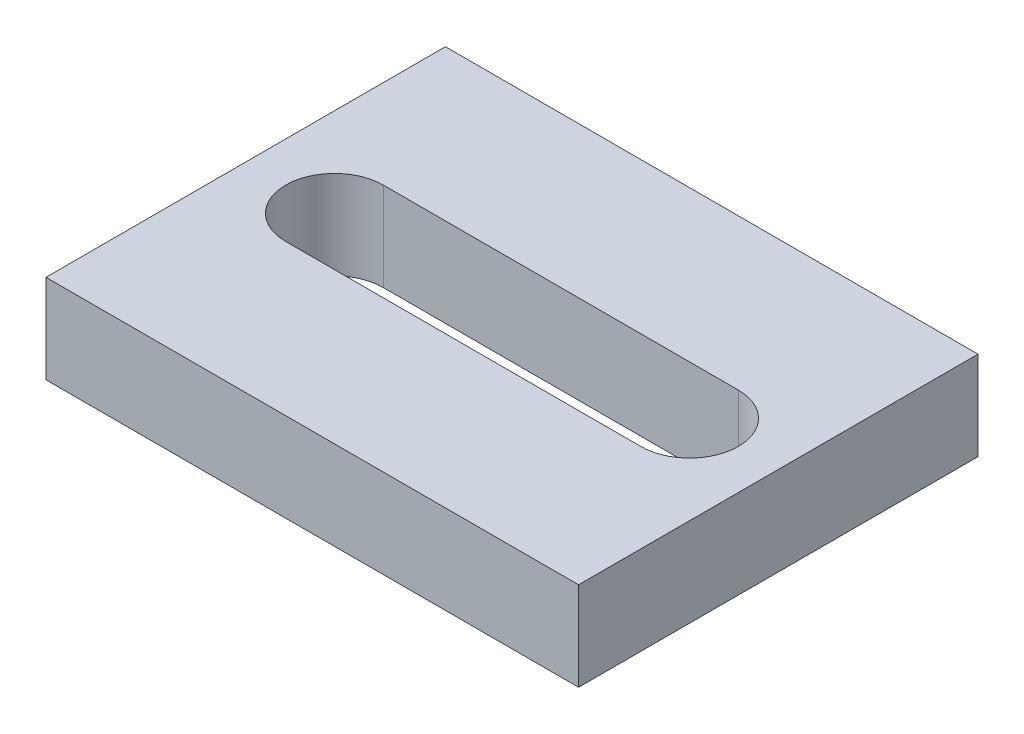
ISO-10303-21;
HEADER;
FILE_DESCRIPTION(('STEP AP214'),'2;1');
FILE_NAME('part.step','',(''),(''),'','','');
FILE_SCHEMA(('AUTOMOTIVE_DESIGN { 1 0 10303 214 1 1 1 1 }'));
ENDSEC;
DATA;
#1=APPLICATION_CONTEXT('core data for automotive mechanical design processes');
#2=APPLICATION_PROTOCOL_DEFINITION('international standard','automotive_design',2000,#1);
#3=PRODUCT_CONTEXT('',#1,'mechanical');
#4=PRODUCT('Part','Part','',(#3));
#5=PRODUCT_RELATED_PRODUCT_CATEGORY('part','',(#4));
#6=PRODUCT_DEFINITION_FORMATION('','',#4);
#7=PRODUCT_DEFINITION_CONTEXT('part definition',#1,'design');
#8=PRODUCT_DEFINITION('design','',#6,#7);
#9=PRODUCT_DEFINITION_SHAPE('','',#8);
#10=(LENGTH_UNIT() NAMED_UNIT(*) SI_UNIT(.MILLI.,.METRE.));
#11=(NAMED_UNIT(*) PLANE_ANGLE_UNIT() SI_UNIT($,.RADIAN.));
#12=(NAMED_UNIT(*) SI_UNIT($,.STERADIAN.) SOLID_ANGLE_UNIT());
#13=UNCERTAINTY_MEASURE_WITH_UNIT(LENGTH_MEASURE(1.E-05),#10,'distance_accuracy_value','');
#14=(GEOMETRIC_REPRESENTATION_CONTEXT(3) GLOBAL_UNCERTAINTY_ASSIGNED_CONTEXT((#13)) GLOBAL_UNIT_ASSIGNED_CONTEXT((#10,
#11,#12)) REPRESENTATION_CONTEXT('',''));
#15=CARTESIAN_POINT('',(0.,0.,0.));
#16=DIRECTION('',(0.,0.,1.));
#17=DIRECTION('',(1.,0.,0.));
#18=AXIS2_PLACEMENT_3D('',#15,#16,#17);
#19=CARTESIAN_POINT('',(0.,6.35,0.));
#20=DIRECTION('',(0.,-1.,0.));
#21=DIRECTION('',(0.,0.,-1.));
#22=AXIS2_PLACEMENT_3D('',#19,#20,#21);
#23=PLANE('',#22);
#24=DIRECTION('',(0.,0.,1.));
#25=VECTOR('',#24,1.);
#26=CARTESIAN_POINT('',(-38.1,6.35,-28.575));
#27=LINE('',#26,#25);
#28=CARTESIAN_POINT('',(-38.1,6.35,-28.575));
#29=VERTEX_POINT('',#28);
#30=CARTESIAN_POINT('',(-38.1,6.35,28.575));
#31=VERTEX_POINT('',#30);
#32=EDGE_CURVE('E134',#29,#31,#27,.T.);
#33=ORIENTED_EDGE('',*,*,#32,.T.);
#34=DIRECTION('',(1.,0.,0.));
#35=VECTOR('',#34,1.);
#36=CARTESIAN_POINT('',(38.1,6.35,28.575));
#37=LINE('',#36,#35);
#38=CARTESIAN_POINT('',(38.1,6.35,28.575));
#39=VERTEX_POINT('',#38);
#40=EDGE_CURVE('E137',#31,#39,#37,.T.);
#41=ORIENTED_EDGE('',*,*,#40,.T.);
#42=DIRECTION('',(0.,0.,-1.));
#43=VECTOR('',#42,1.);
#44=CARTESIAN_POINT('',(38.1,6.35,-28.575));
#45=LINE('',#44,#43);
#46=CARTESIAN_POINT('',(38.1,6.35,-28.575));
#47=VERTEX_POINT('',#46);
#48=EDGE_CURVE('E140',#39,#47,#45,.T.);
#49=ORIENTED_EDGE('',*,*,#48,.T.);
#50=DIRECTION('',(-1.,0.,0.));
#51=VECTOR('',#50,1.);
#52=CARTESIAN_POINT('',(38.1,6.35,-28.575));
#53=LINE('',#52,#51);
#54=EDGE_CURVE('E142',#47,#29,#53,.T.);
#55=ORIENTED_EDGE('',*,*,#54,.T.);
#56=EDGE_LOOP('',(#33,#41,#49,#55));
#57=FACE_BOUND('',#56,.T.);
#58=CARTESIAN_POINT('',(-25.4,6.35,0.));
#59=DIRECTION('',(0.,1.,0.));
#60=DIRECTION('',(0.,0.,1.));
#61=AXIS2_PLACEMENT_3D('',#58,#59,#60);
#62=CIRCLE('',#61,6.985);
#63=CARTESIAN_POINT('',(-25.4,6.35,-6.985));
#64=VERTEX_POINT('',#63);
#65=CARTESIAN_POINT('',(-25.4,6.35,6.985));
#66=VERTEX_POINT('',#65);
#67=EDGE_CURVE('E98',#64,#66,#62,.T.);
#68=ORIENTED_EDGE('',*,*,#67,.F.);
#69=DIRECTION('',(-1.,0.,0.));
#70=VECTOR('',#69,1.);
#71=CARTESIAN_POINT('',(-25.4,6.35,-6.985));
#72=LINE('',#71,#70);
#73=CARTESIAN_POINT('',(25.4,6.35,-6.985));
#74=VERTEX_POINT('',#73);
#75=EDGE_CURVE('E120',#74,#64,#72,.T.);
#76=ORIENTED_EDGE('',*,*,#75,.F.);
#77=CARTESIAN_POINT('',(25.4,6.35,0.));
#78=DIRECTION('',(0.,1.,0.));
#79=DIRECTION('',(0.,0.,1.));
#80=AXIS2_PLACEMENT_3D('',#77,#78,#79);
#81=CIRCLE('',#80,6.985);
#82=CARTESIAN_POINT('',(25.4,6.35,6.985));
#83=VERTEX_POINT('',#82);
#84=EDGE_CURVE('E118',#83,#74,#81,.T.);
#85=ORIENTED_EDGE('',*,*,#84,.F.);
#86=DIRECTION('',(1.,0.,0.));
#87=VECTOR('',#86,1.);
#88=CARTESIAN_POINT('',(-25.4,6.35,6.985));
#89=LINE('',#88,#87);
#90=EDGE_CURVE('E106',#66,#83,#89,.T.);
#91=ORIENTED_EDGE('',*,*,#90,.F.);
#92=EDGE_LOOP('',(#68,#76,#85,#91));
#93=FACE_BOUND('',#92,.T.);
#94=ADVANCED_FACE('F33',(#57,#93),#23,.F.);
#95=CARTESIAN_POINT('',(0.,-6.35,0.));
#96=DIRECTION('',(0.,-1.,0.));
#97=DIRECTION('',(0.,0.,-1.));
#98=AXIS2_PLACEMENT_3D('',#95,#96,#97);
#99=PLANE('',#98);
#100=DIRECTION('',(0.,0.,1.));
#101=VECTOR('',#100,1.);
#102=CARTESIAN_POINT('',(-38.1,-6.35,-28.575));
#103=LINE('',#102,#101);
#104=CARTESIAN_POINT('',(-38.1,-6.35,-28.575));
#105=VERTEX_POINT('',#104);
#106=CARTESIAN_POINT('',(-38.1,-6.35,28.575));
#107=VERTEX_POINT('',#106);
#108=EDGE_CURVE('E114',#105,#107,#103,.T.);
#109=ORIENTED_EDGE('',*,*,#108,.F.);
#110=DIRECTION('',(-1.,0.,0.));
#111=VECTOR('',#110,1.);
#112=CARTESIAN_POINT('',(38.1,-6.35,-28.575));
#113=LINE('',#112,#111);
#114=CARTESIAN_POINT('',(38.1,-6.35,-28.575));
#115=VERTEX_POINT('',#114);
#116=EDGE_CURVE('E138',#115,#105,#113,.T.);
#117=ORIENTED_EDGE('',*,*,#116,.F.);
#118=DIRECTION('',(0.,0.,-1.));
#119=VECTOR('',#118,1.);
#120=CARTESIAN_POINT('',(38.1,-6.35,-28.575));
#121=LINE('',#120,#119);
#122=CARTESIAN_POINT('',(38.1,-6.35,28.575));
#123=VERTEX_POINT('',#122);
#124=EDGE_CURVE('E149',#123,#115,#121,.T.);
#125=ORIENTED_EDGE('',*,*,#124,.F.);
#126=DIRECTION('',(1.,0.,0.));
#127=VECTOR('',#126,1.);
#128=CARTESIAN_POINT('',(38.1,-6.35,28.575));
#129=LINE('',#128,#127);
#130=EDGE_CURVE('E147',#107,#123,#129,.T.);
#131=ORIENTED_EDGE('',*,*,#130,.F.);
#132=EDGE_LOOP('',(#109,#117,#125,#131));
#133=FACE_BOUND('',#132,.T.);
#134=DIRECTION('',(-1.,0.,0.));
#135=VECTOR('',#134,1.);
#136=CARTESIAN_POINT('',(-25.4,-6.35,-6.985));
#137=LINE('',#136,#135);
#138=CARTESIAN_POINT('',(25.4,-6.35,-6.985));
#139=VERTEX_POINT('',#138);
#140=CARTESIAN_POINT('',(-25.4,-6.35,-6.985));
#141=VERTEX_POINT('',#140);
#142=EDGE_CURVE('E107',#139,#141,#137,.T.);
#143=ORIENTED_EDGE('',*,*,#142,.T.);
#144=CARTESIAN_POINT('',(-25.4,-6.35,0.));
#145=DIRECTION('',(0.,1.,0.));
#146=DIRECTION('',(0.,0.,1.));
#147=AXIS2_PLACEMENT_3D('',#144,#145,#146);
#148=CIRCLE('',#147,6.985);
#149=CARTESIAN_POINT('',(-25.4,-6.35,6.985));
#150=VERTEX_POINT('',#149);
#151=EDGE_CURVE('E56',#141,#150,#148,.T.);
#152=ORIENTED_EDGE('',*,*,#151,.T.);
#153=DIRECTION('',(1.,0.,0.));
#154=VECTOR('',#153,1.);
#155=CARTESIAN_POINT('',(-25.4,-6.35,6.985));
#156=LINE('',#155,#154);
#157=CARTESIAN_POINT('',(25.4,-6.35,6.985));
#158=VERTEX_POINT('',#157);
#159=EDGE_CURVE('E113',#150,#158,#156,.T.);
#160=ORIENTED_EDGE('',*,*,#159,.T.);
#161=CARTESIAN_POINT('',(25.4,-6.35,0.));
#162=DIRECTION('',(0.,1.,0.));
#163=DIRECTION('',(0.,0.,1.));
#164=AXIS2_PLACEMENT_3D('',#161,#162,#163);
#165=CIRCLE('',#164,6.985);
#166=EDGE_CURVE('E126',#158,#139,#165,.T.);
#167=ORIENTED_EDGE('',*,*,#166,.T.);
#168=EDGE_LOOP('',(#143,#152,#160,#167));
#169=FACE_BOUND('',#168,.T.);
#170=ADVANCED_FACE('F167',(#133,#169),#99,.T.);
#171=CARTESIAN_POINT('',(-38.1,6.35,-28.575));
#172=DIRECTION('',(1.,0.,0.));
#173=DIRECTION('',(0.,0.,-1.));
#174=AXIS2_PLACEMENT_3D('',#171,#172,#173);
#175=PLANE('',#174);
#176=ORIENTED_EDGE('',*,*,#108,.T.);
#177=DIRECTION('',(0.,-1.,0.));
#178=VECTOR('',#177,1.);
#179=CARTESIAN_POINT('',(-38.1,6.35,28.575));
#180=LINE('',#179,#178);
#181=EDGE_CURVE('E11',#31,#107,#180,.T.);
#182=ORIENTED_EDGE('',*,*,#181,.F.);
#183=ORIENTED_EDGE('',*,*,#32,.F.);
#184=DIRECTION('',(0.,-1.,0.));
#185=VECTOR('',#184,1.);
#186=CARTESIAN_POINT('',(-38.1,6.35,-28.575));
#187=LINE('',#186,#185);
#188=EDGE_CURVE('E144',#29,#105,#187,.T.);
#189=ORIENTED_EDGE('',*,*,#188,.T.);
#190=EDGE_LOOP('',(#176,#182,#183,#189));
#191=FACE_BOUND('',#190,.T.);
#192=ADVANCED_FACE('F35',(#191),#175,.F.);
#193=CARTESIAN_POINT('',(38.1,6.35,28.575));
#194=DIRECTION('',(0.,0.,-1.));
#195=DIRECTION('',(-1.,0.,0.));
#196=AXIS2_PLACEMENT_3D('',#193,#194,#195);
#197=PLANE('',#196);
#198=ORIENTED_EDGE('',*,*,#130,.T.);
#199=DIRECTION('',(0.,-1.,0.));
#200=VECTOR('',#199,1.);
#201=CARTESIAN_POINT('',(38.1,6.35,28.575));
#202=LINE('',#201,#200);
#203=EDGE_CURVE('E41',#39,#123,#202,.T.);
#204=ORIENTED_EDGE('',*,*,#203,.F.);
#205=ORIENTED_EDGE('',*,*,#40,.F.);
#206=ORIENTED_EDGE('',*,*,#181,.T.);
#207=EDGE_LOOP('',(#198,#204,#205,#206));
#208=FACE_BOUND('',#207,.T.);
#209=ADVANCED_FACE('F177',(#208),#197,.F.);
#210=CARTESIAN_POINT('',(38.1,6.35,-28.575));
#211=DIRECTION('',(-1.,0.,0.));
#212=DIRECTION('',(0.,0.,1.));
#213=AXIS2_PLACEMENT_3D('',#210,#211,#212);
#214=PLANE('',#213);
#215=ORIENTED_EDGE('',*,*,#124,.T.);
#216=DIRECTION('',(0.,-1.,0.));
#217=VECTOR('',#216,1.);
#218=CARTESIAN_POINT('',(38.1,6.35,-28.575));
#219=LINE('',#218,#217);
#220=EDGE_CURVE('E154',#47,#115,#219,.T.);
#221=ORIENTED_EDGE('',*,*,#220,.F.);
#222=ORIENTED_EDGE('',*,*,#48,.F.);
#223=ORIENTED_EDGE('',*,*,#203,.T.);
#224=EDGE_LOOP('',(#215,#221,#222,#223));
#225=FACE_BOUND('',#224,.T.);
#226=ADVANCED_FACE('F161',(#225),#214,.F.);
#227=CARTESIAN_POINT('',(38.1,6.35,-28.575));
#228=DIRECTION('',(0.,0.,1.));
#229=DIRECTION('',(1.,0.,0.));
#230=AXIS2_PLACEMENT_3D('',#227,#228,#229);
#231=PLANE('',#230);
#232=ORIENTED_EDGE('',*,*,#116,.T.);
#233=ORIENTED_EDGE('',*,*,#188,.F.);
#234=ORIENTED_EDGE('',*,*,#54,.F.);
#235=ORIENTED_EDGE('',*,*,#220,.T.);
#236=EDGE_LOOP('',(#232,#233,#234,#235));
#237=FACE_BOUND('',#236,.T.);
#238=ADVANCED_FACE('F171',(#237),#231,.F.);
#239=CARTESIAN_POINT('',(-25.4,6.35,0.));
#240=DIRECTION('',(0.,-1.,0.));
#241=DIRECTION('',(0.,0.,-1.));
#242=AXIS2_PLACEMENT_3D('',#239,#240,#241);
#243=CYLINDRICAL_SURFACE('',#242,6.985);
#244=ORIENTED_EDGE('',*,*,#151,.F.);
#245=DIRECTION('',(0.,-1.,0.));
#246=VECTOR('',#245,1.);
#247=CARTESIAN_POINT('',(-25.4,6.35,-6.985));
#248=LINE('',#247,#246);
#249=EDGE_CURVE('E102',#64,#141,#248,.T.);
#250=ORIENTED_EDGE('',*,*,#249,.F.);
#251=ORIENTED_EDGE('',*,*,#67,.T.);
#252=DIRECTION('',(0.,-1.,0.));
#253=VECTOR('',#252,1.);
#254=CARTESIAN_POINT('',(-25.4,6.35,6.985));
#255=LINE('',#254,#253);
#256=EDGE_CURVE('E101',#66,#150,#255,.T.);
#257=ORIENTED_EDGE('',*,*,#256,.T.);
#258=EDGE_LOOP('',(#244,#250,#251,#257));
#259=FACE_BOUND('',#258,.T.);
#260=ADVANCED_FACE('F100',(#259),#243,.F.);
#261=CARTESIAN_POINT('',(-25.4,6.35,6.985));
#262=DIRECTION('',(0.,0.,-1.));
#263=DIRECTION('',(-1.,0.,0.));
#264=AXIS2_PLACEMENT_3D('',#261,#262,#263);
#265=PLANE('',#264);
#266=ORIENTED_EDGE('',*,*,#159,.F.);
#267=ORIENTED_EDGE('',*,*,#256,.F.);
#268=ORIENTED_EDGE('',*,*,#90,.T.);
#269=DIRECTION('',(0.,-1.,0.));
#270=VECTOR('',#269,1.);
#271=CARTESIAN_POINT('',(25.4,6.35,6.985));
#272=LINE('',#271,#270);
#273=EDGE_CURVE('E115',#83,#158,#272,.T.);
#274=ORIENTED_EDGE('',*,*,#273,.T.);
#275=EDGE_LOOP('',(#266,#267,#268,#274));
#276=FACE_BOUND('',#275,.T.);
#277=ADVANCED_FACE('F110',(#276),#265,.T.);
#278=CARTESIAN_POINT('',(25.4,6.35,0.));
#279=DIRECTION('',(0.,-1.,0.));
#280=DIRECTION('',(0.,0.,-1.));
#281=AXIS2_PLACEMENT_3D('',#278,#279,#280);
#282=CYLINDRICAL_SURFACE('',#281,6.985);
#283=ORIENTED_EDGE('',*,*,#166,.F.);
#284=ORIENTED_EDGE('',*,*,#273,.F.);
#285=ORIENTED_EDGE('',*,*,#84,.T.);
#286=DIRECTION('',(0.,-1.,0.));
#287=VECTOR('',#286,1.);
#288=CARTESIAN_POINT('',(25.4,6.35,-6.985));
#289=LINE('',#288,#287);
#290=EDGE_CURVE('E48',#74,#139,#289,.T.);
#291=ORIENTED_EDGE('',*,*,#290,.T.);
#292=EDGE_LOOP('',(#283,#284,#285,#291));
#293=FACE_BOUND('',#292,.T.);
#294=ADVANCED_FACE('F200',(#293),#282,.F.);
#295=CARTESIAN_POINT('',(-25.4,6.35,-6.985));
#296=DIRECTION('',(0.,0.,1.));
#297=DIRECTION('',(1.,0.,0.));
#298=AXIS2_PLACEMENT_3D('',#295,#296,#297);
#299=PLANE('',#298);
#300=ORIENTED_EDGE('',*,*,#142,.F.);
#301=ORIENTED_EDGE('',*,*,#290,.F.);
#302=ORIENTED_EDGE('',*,*,#75,.T.);
#303=ORIENTED_EDGE('',*,*,#249,.T.);
#304=EDGE_LOOP('',(#300,#301,#302,#303));
#305=FACE_BOUND('',#304,.T.);
#306=ADVANCED_FACE('F204',(#305),#299,.T.);
#307=CLOSED_SHELL('',(#94,#170,#192,#209,#226,#238,#260,#277,#294,#306));
#308=MANIFOLD_SOLID_BREP('B2',#307);
#309=ADVANCED_BREP_SHAPE_REPRESENTATION('',(#18,#308),#14);
#310=SHAPE_DEFINITION_REPRESENTATION(#9,#309);
ENDSEC;
END-ISO-10303-21;
